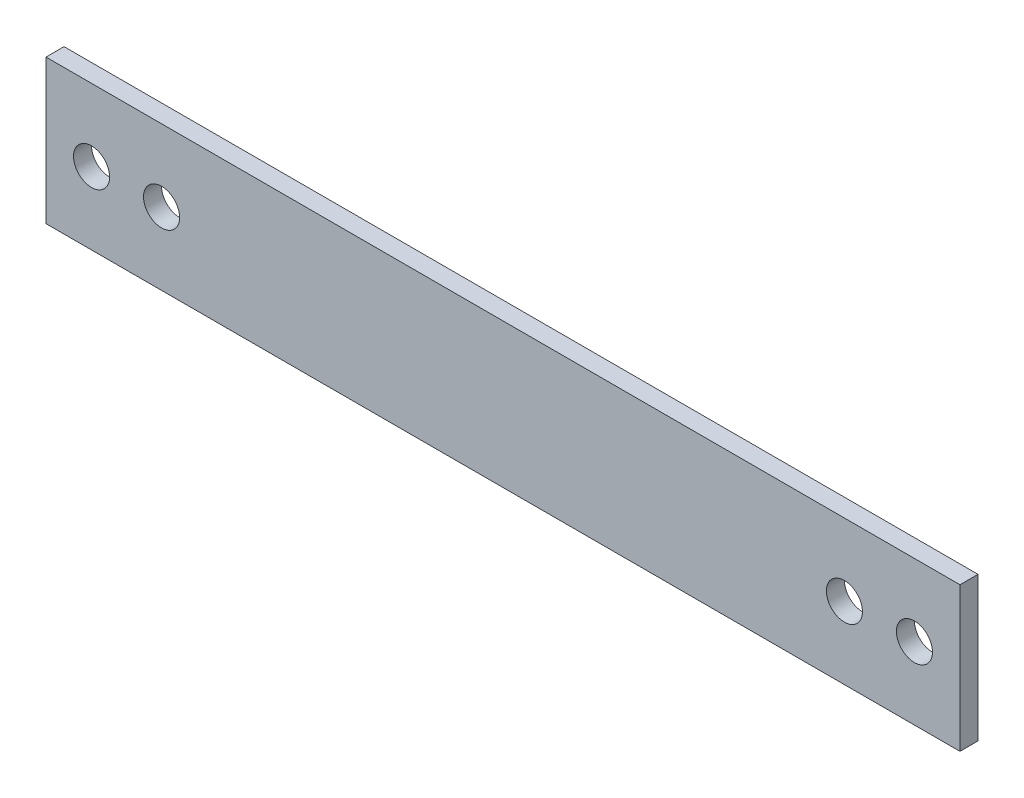
ISO-10303-21;
HEADER;
FILE_DESCRIPTION(('STEP AP214'),'2;1');
FILE_NAME('part.step','',(''),(''),'','','');
FILE_SCHEMA(('AUTOMOTIVE_DESIGN { 1 0 10303 214 1 1 1 1 }'));
ENDSEC;
DATA;
#1=APPLICATION_CONTEXT('core data for automotive mechanical design processes');
#2=APPLICATION_PROTOCOL_DEFINITION('international standard','automotive_design',2000,#1);
#3=PRODUCT_CONTEXT('',#1,'mechanical');
#4=PRODUCT('Part','Part','',(#3));
#5=PRODUCT_RELATED_PRODUCT_CATEGORY('part','',(#4));
#6=PRODUCT_DEFINITION_FORMATION('','',#4);
#7=PRODUCT_DEFINITION_CONTEXT('part definition',#1,'design');
#8=PRODUCT_DEFINITION('design','',#6,#7);
#9=PRODUCT_DEFINITION_SHAPE('','',#8);
#10=(LENGTH_UNIT() NAMED_UNIT(*) SI_UNIT(.MILLI.,.METRE.));
#11=(NAMED_UNIT(*) PLANE_ANGLE_UNIT() SI_UNIT($,.RADIAN.));
#12=(NAMED_UNIT(*) SI_UNIT($,.STERADIAN.) SOLID_ANGLE_UNIT());
#13=UNCERTAINTY_MEASURE_WITH_UNIT(LENGTH_MEASURE(1.E-05),#10,'distance_accuracy_value','');
#14=(GEOMETRIC_REPRESENTATION_CONTEXT(3) GLOBAL_UNCERTAINTY_ASSIGNED_CONTEXT((#13)) GLOBAL_UNIT_ASSIGNED_CONTEXT((#10,
#11,#12)) REPRESENTATION_CONTEXT('',''));
#15=CARTESIAN_POINT('',(0.,0.,0.));
#16=DIRECTION('',(0.,0.,1.));
#17=DIRECTION('',(1.,0.,0.));
#18=AXIS2_PLACEMENT_3D('',#15,#16,#17);
#19=CARTESIAN_POINT('',(0.,0.,4.7625));
#20=DIRECTION('',(0.,0.,-1.));
#21=DIRECTION('',(-1.,0.,0.));
#22=AXIS2_PLACEMENT_3D('',#19,#20,#21);
#23=PLANE('',#22);
#24=DIRECTION('',(0.,1.,0.));
#25=VECTOR('',#24,1.);
#26=CARTESIAN_POINT('',(120.65,-19.05,4.7625));
#27=LINE('',#26,#25);
#28=CARTESIAN_POINT('',(120.65,-19.05,4.7625));
#29=VERTEX_POINT('',#28);
#30=CARTESIAN_POINT('',(120.65,19.05,4.7625));
#31=VERTEX_POINT('',#30);
#32=EDGE_CURVE('E96',#29,#31,#27,.T.);
#33=ORIENTED_EDGE('',*,*,#32,.T.);
#34=DIRECTION('',(-1.,0.,0.));
#35=VECTOR('',#34,1.);
#36=CARTESIAN_POINT('',(-120.65,19.05,4.7625));
#37=LINE('',#36,#35);
#38=CARTESIAN_POINT('',(-120.65,19.05,4.7625));
#39=VERTEX_POINT('',#38);
#40=EDGE_CURVE('E91',#31,#39,#37,.T.);
#41=ORIENTED_EDGE('',*,*,#40,.T.);
#42=DIRECTION('',(0.,-1.,0.));
#43=VECTOR('',#42,1.);
#44=CARTESIAN_POINT('',(-120.65,-19.05,4.7625));
#45=LINE('',#44,#43);
#46=CARTESIAN_POINT('',(-120.65,-19.05,4.7625));
#47=VERTEX_POINT('',#46);
#48=EDGE_CURVE('E94',#39,#47,#45,.T.);
#49=ORIENTED_EDGE('',*,*,#48,.T.);
#50=DIRECTION('',(1.,0.,0.));
#51=VECTOR('',#50,1.);
#52=CARTESIAN_POINT('',(-120.65,-19.05,4.7625));
#53=LINE('',#52,#51);
#54=EDGE_CURVE('E61',#47,#29,#53,.T.);
#55=ORIENTED_EDGE('',*,*,#54,.T.);
#56=EDGE_LOOP('',(#33,#41,#49,#55));
#57=FACE_BOUND('',#56,.T.);
#58=CARTESIAN_POINT('',(-108.625531914894,0.,4.7625));
#59=DIRECTION('',(0.,0.,1.));
#60=DIRECTION('',(1.,0.,0.));
#61=AXIS2_PLACEMENT_3D('',#58,#59,#60);
#62=CIRCLE('',#61,4.7625);
#63=CARTESIAN_POINT('',(-113.388031914894,0.,4.7625));
#64=VERTEX_POINT('',#63);
#65=EDGE_CURVE('E116',#64,#64,#62,.T.);
#66=ORIENTED_EDGE('',*,*,#65,.F.);
#67=EDGE_LOOP('',(#66));
#68=FACE_BOUND('',#67,.T.);
#69=CARTESIAN_POINT('',(-90.1429787234043,0.,4.7625));
#70=DIRECTION('',(0.,0.,1.));
#71=DIRECTION('',(1.,0.,0.));
#72=AXIS2_PLACEMENT_3D('',#69,#70,#71);
#73=CIRCLE('',#72,4.7625);
#74=CARTESIAN_POINT('',(-94.9054787234043,0.,4.7625));
#75=VERTEX_POINT('',#74);
#76=EDGE_CURVE('E138',#75,#75,#73,.T.);
#77=ORIENTED_EDGE('',*,*,#76,.F.);
#78=EDGE_LOOP('',(#77));
#79=FACE_BOUND('',#78,.T.);
#80=CARTESIAN_POINT('',(90.1429787234043,0.,4.7625));
#81=DIRECTION('',(0.,0.,1.));
#82=DIRECTION('',(-1.,0.,0.));
#83=AXIS2_PLACEMENT_3D('',#80,#81,#82);
#84=CIRCLE('',#83,4.7625);
#85=CARTESIAN_POINT('',(85.3804787234043,0.,4.7625));
#86=VERTEX_POINT('',#85);
#87=EDGE_CURVE('E146',#86,#86,#84,.T.);
#88=ORIENTED_EDGE('',*,*,#87,.F.);
#89=EDGE_LOOP('',(#88));
#90=FACE_BOUND('',#89,.T.);
#91=CARTESIAN_POINT('',(108.625531914894,0.,4.7625));
#92=DIRECTION('',(0.,0.,1.));
#93=DIRECTION('',(-1.,0.,0.));
#94=AXIS2_PLACEMENT_3D('',#91,#92,#93);
#95=CIRCLE('',#94,4.7625);
#96=CARTESIAN_POINT('',(103.863031914894,0.,4.7625));
#97=VERTEX_POINT('',#96);
#98=EDGE_CURVE('E154',#97,#97,#95,.T.);
#99=ORIENTED_EDGE('',*,*,#98,.F.);
#100=EDGE_LOOP('',(#99));
#101=FACE_BOUND('',#100,.T.);
#102=ADVANCED_FACE('F43',(#57,#68,#79,#90,#101),#23,.F.);
#103=CARTESIAN_POINT('',(0.,0.,0.));
#104=DIRECTION('',(0.,0.,-1.));
#105=DIRECTION('',(-1.,0.,0.));
#106=AXIS2_PLACEMENT_3D('',#103,#104,#105);
#107=PLANE('',#106);
#108=CARTESIAN_POINT('',(90.1429787234043,0.,0.));
#109=DIRECTION('',(0.,0.,1.));
#110=DIRECTION('',(-1.,0.,0.));
#111=AXIS2_PLACEMENT_3D('',#108,#109,#110);
#112=CIRCLE('',#111,4.7625);
#113=CARTESIAN_POINT('',(85.3804787234043,0.,0.));
#114=VERTEX_POINT('',#113);
#115=EDGE_CURVE('E150',#114,#114,#112,.T.);
#116=ORIENTED_EDGE('',*,*,#115,.T.);
#117=EDGE_LOOP('',(#116));
#118=FACE_BOUND('',#117,.T.);
#119=CARTESIAN_POINT('',(-108.625531914894,0.,0.));
#120=DIRECTION('',(0.,0.,1.));
#121=DIRECTION('',(1.,0.,0.));
#122=AXIS2_PLACEMENT_3D('',#119,#120,#121);
#123=CIRCLE('',#122,4.7625);
#124=CARTESIAN_POINT('',(-113.388031914894,0.,0.));
#125=VERTEX_POINT('',#124);
#126=EDGE_CURVE('E134',#125,#125,#123,.T.);
#127=ORIENTED_EDGE('',*,*,#126,.T.);
#128=EDGE_LOOP('',(#127));
#129=FACE_BOUND('',#128,.T.);
#130=DIRECTION('',(0.,1.,0.));
#131=VECTOR('',#130,1.);
#132=CARTESIAN_POINT('',(120.65,-19.05,0.));
#133=LINE('',#132,#131);
#134=CARTESIAN_POINT('',(120.65,-19.05,0.));
#135=VERTEX_POINT('',#134);
#136=CARTESIAN_POINT('',(120.65,19.05,0.));
#137=VERTEX_POINT('',#136);
#138=EDGE_CURVE('E112',#135,#137,#133,.T.);
#139=ORIENTED_EDGE('',*,*,#138,.F.);
#140=DIRECTION('',(1.,0.,0.));
#141=VECTOR('',#140,1.);
#142=CARTESIAN_POINT('',(-120.65,-19.05,0.));
#143=LINE('',#142,#141);
#144=CARTESIAN_POINT('',(-120.65,-19.05,0.));
#145=VERTEX_POINT('',#144);
#146=EDGE_CURVE('E84',#145,#135,#143,.T.);
#147=ORIENTED_EDGE('',*,*,#146,.F.);
#148=DIRECTION('',(0.,-1.,0.));
#149=VECTOR('',#148,1.);
#150=CARTESIAN_POINT('',(-120.65,-19.05,0.));
#151=LINE('',#150,#149);
#152=CARTESIAN_POINT('',(-120.65,19.05,0.));
#153=VERTEX_POINT('',#152);
#154=EDGE_CURVE('E78',#153,#145,#151,.T.);
#155=ORIENTED_EDGE('',*,*,#154,.F.);
#156=DIRECTION('',(-1.,0.,0.));
#157=VECTOR('',#156,1.);
#158=CARTESIAN_POINT('',(-120.65,19.05,0.));
#159=LINE('',#158,#157);
#160=EDGE_CURVE('E101',#137,#153,#159,.T.);
#161=ORIENTED_EDGE('',*,*,#160,.F.);
#162=EDGE_LOOP('',(#139,#147,#155,#161));
#163=FACE_BOUND('',#162,.T.);
#164=CARTESIAN_POINT('',(-90.1429787234043,0.,0.));
#165=DIRECTION('',(0.,0.,1.));
#166=DIRECTION('',(1.,0.,0.));
#167=AXIS2_PLACEMENT_3D('',#164,#165,#166);
#168=CIRCLE('',#167,4.7625);
#169=CARTESIAN_POINT('',(-94.9054787234043,0.,0.));
#170=VERTEX_POINT('',#169);
#171=EDGE_CURVE('E142',#170,#170,#168,.T.);
#172=ORIENTED_EDGE('',*,*,#171,.T.);
#173=EDGE_LOOP('',(#172));
#174=FACE_BOUND('',#173,.T.);
#175=CARTESIAN_POINT('',(108.625531914894,0.,0.));
#176=DIRECTION('',(0.,0.,1.));
#177=DIRECTION('',(-1.,0.,0.));
#178=AXIS2_PLACEMENT_3D('',#175,#176,#177);
#179=CIRCLE('',#178,4.7625);
#180=CARTESIAN_POINT('',(103.863031914894,0.,0.));
#181=VERTEX_POINT('',#180);
#182=EDGE_CURVE('E158',#181,#181,#179,.T.);
#183=ORIENTED_EDGE('',*,*,#182,.T.);
#184=EDGE_LOOP('',(#183));
#185=FACE_BOUND('',#184,.T.);
#186=ADVANCED_FACE('F129',(#118,#129,#163,#174,#185),#107,.T.);
#187=CARTESIAN_POINT('',(120.65,-19.05,4.7625));
#188=DIRECTION('',(-1.,0.,0.));
#189=DIRECTION('',(0.,0.,1.));
#190=AXIS2_PLACEMENT_3D('',#187,#188,#189);
#191=PLANE('',#190);
#192=ORIENTED_EDGE('',*,*,#138,.T.);
#193=DIRECTION('',(0.,0.,-1.));
#194=VECTOR('',#193,1.);
#195=CARTESIAN_POINT('',(120.65,19.05,4.7625));
#196=LINE('',#195,#194);
#197=EDGE_CURVE('E11',#31,#137,#196,.T.);
#198=ORIENTED_EDGE('',*,*,#197,.F.);
#199=ORIENTED_EDGE('',*,*,#32,.F.);
#200=DIRECTION('',(0.,0.,-1.));
#201=VECTOR('',#200,1.);
#202=CARTESIAN_POINT('',(120.65,-19.05,4.7625));
#203=LINE('',#202,#201);
#204=EDGE_CURVE('E108',#29,#135,#203,.T.);
#205=ORIENTED_EDGE('',*,*,#204,.T.);
#206=EDGE_LOOP('',(#192,#198,#199,#205));
#207=FACE_BOUND('',#206,.T.);
#208=ADVANCED_FACE('F45',(#207),#191,.F.);
#209=CARTESIAN_POINT('',(-120.65,19.05,4.7625));
#210=DIRECTION('',(0.,-1.,0.));
#211=DIRECTION('',(0.,0.,-1.));
#212=AXIS2_PLACEMENT_3D('',#209,#210,#211);
#213=PLANE('',#212);
#214=ORIENTED_EDGE('',*,*,#160,.T.);
#215=DIRECTION('',(0.,0.,-1.));
#216=VECTOR('',#215,1.);
#217=CARTESIAN_POINT('',(-120.65,19.05,4.7625));
#218=LINE('',#217,#216);
#219=EDGE_CURVE('E53',#39,#153,#218,.T.);
#220=ORIENTED_EDGE('',*,*,#219,.F.);
#221=ORIENTED_EDGE('',*,*,#40,.F.);
#222=ORIENTED_EDGE('',*,*,#197,.T.);
#223=EDGE_LOOP('',(#214,#220,#221,#222));
#224=FACE_BOUND('',#223,.T.);
#225=ADVANCED_FACE('F100',(#224),#213,.F.);
#226=CARTESIAN_POINT('',(-120.65,-19.05,4.7625));
#227=DIRECTION('',(1.,0.,0.));
#228=DIRECTION('',(0.,0.,-1.));
#229=AXIS2_PLACEMENT_3D('',#226,#227,#228);
#230=PLANE('',#229);
#231=ORIENTED_EDGE('',*,*,#154,.T.);
#232=DIRECTION('',(0.,0.,-1.));
#233=VECTOR('',#232,1.);
#234=CARTESIAN_POINT('',(-120.65,-19.05,4.7625));
#235=LINE('',#234,#233);
#236=EDGE_CURVE('E103',#47,#145,#235,.T.);
#237=ORIENTED_EDGE('',*,*,#236,.F.);
#238=ORIENTED_EDGE('',*,*,#48,.F.);
#239=ORIENTED_EDGE('',*,*,#219,.T.);
#240=EDGE_LOOP('',(#231,#237,#238,#239));
#241=FACE_BOUND('',#240,.T.);
#242=ADVANCED_FACE('F104',(#241),#230,.F.);
#243=CARTESIAN_POINT('',(-120.65,-19.05,4.7625));
#244=DIRECTION('',(0.,1.,0.));
#245=DIRECTION('',(0.,0.,1.));
#246=AXIS2_PLACEMENT_3D('',#243,#244,#245);
#247=PLANE('',#246);
#248=ORIENTED_EDGE('',*,*,#146,.T.);
#249=ORIENTED_EDGE('',*,*,#204,.F.);
#250=ORIENTED_EDGE('',*,*,#54,.F.);
#251=ORIENTED_EDGE('',*,*,#236,.T.);
#252=EDGE_LOOP('',(#248,#249,#250,#251));
#253=FACE_BOUND('',#252,.T.);
#254=ADVANCED_FACE('F126',(#253),#247,.F.);
#255=CARTESIAN_POINT('',(-108.625531914894,0.,4.7625));
#256=DIRECTION('',(0.,0.,-1.));
#257=DIRECTION('',(-1.,0.,0.));
#258=AXIS2_PLACEMENT_3D('',#255,#256,#257);
#259=CYLINDRICAL_SURFACE('',#258,4.7625);
#260=CARTESIAN_POINT('',(-113.388031914894,0.,4.7625));
#261=CARTESIAN_POINT('',(-113.388031914894,0.,4.712890625));
#262=CARTESIAN_POINT('',(-113.388031914894,0.,4.66328125));
#263=CARTESIAN_POINT('',(-113.388031914894,0.,4.5640625));
#264=CARTESIAN_POINT('',(-113.388031914894,0.,4.514453125));
#265=CARTESIAN_POINT('',(-113.388031914894,0.,4.415234375));
#266=CARTESIAN_POINT('',(-113.388031914894,0.,4.365625));
#267=CARTESIAN_POINT('',(-113.388031914894,0.,4.26640625));
#268=CARTESIAN_POINT('',(-113.388031914894,0.,4.216796875));
#269=CARTESIAN_POINT('',(-113.388031914894,0.,4.117578125));
#270=CARTESIAN_POINT('',(-113.388031914894,0.,4.06796875));
#271=CARTESIAN_POINT('',(-113.388031914894,0.,3.96875));
#272=CARTESIAN_POINT('',(-113.388031914894,0.,3.919140625));
#273=CARTESIAN_POINT('',(-113.388031914894,0.,3.819921875));
#274=CARTESIAN_POINT('',(-113.388031914894,0.,3.7703125));
#275=CARTESIAN_POINT('',(-113.388031914894,0.,3.67109375));
#276=CARTESIAN_POINT('',(-113.388031914894,0.,3.621484375));
#277=CARTESIAN_POINT('',(-113.388031914894,0.,3.522265625));
#278=CARTESIAN_POINT('',(-113.388031914894,0.,3.47265625));
#279=CARTESIAN_POINT('',(-113.388031914894,0.,3.3734375));
#280=CARTESIAN_POINT('',(-113.388031914894,0.,3.323828125));
#281=CARTESIAN_POINT('',(-113.388031914894,0.,3.224609375));
#282=CARTESIAN_POINT('',(-113.388031914894,0.,3.175));
#283=CARTESIAN_POINT('',(-113.388031914894,0.,3.07578125));
#284=CARTESIAN_POINT('',(-113.388031914894,0.,3.026171875));
#285=CARTESIAN_POINT('',(-113.388031914894,0.,2.926953125));
#286=CARTESIAN_POINT('',(-113.388031914894,0.,2.87734375));
#287=CARTESIAN_POINT('',(-113.388031914894,0.,2.778125));
#288=CARTESIAN_POINT('',(-113.388031914894,0.,2.728515625));
#289=CARTESIAN_POINT('',(-113.388031914894,0.,2.629296875));
#290=CARTESIAN_POINT('',(-113.388031914894,0.,2.5796875));
#291=CARTESIAN_POINT('',(-113.388031914894,0.,2.48046875));
#292=CARTESIAN_POINT('',(-113.388031914894,0.,2.430859375));
#293=CARTESIAN_POINT('',(-113.388031914894,0.,2.331640625));
#294=CARTESIAN_POINT('',(-113.388031914894,0.,2.28203125));
#295=CARTESIAN_POINT('',(-113.388031914894,0.,2.1828125));
#296=CARTESIAN_POINT('',(-113.388031914894,0.,2.133203125));
#297=CARTESIAN_POINT('',(-113.388031914894,0.,2.033984375));
#298=CARTESIAN_POINT('',(-113.388031914894,0.,1.984375));
#299=CARTESIAN_POINT('',(-113.388031914894,0.,1.88515625));
#300=CARTESIAN_POINT('',(-113.388031914894,0.,1.835546875));
#301=CARTESIAN_POINT('',(-113.388031914894,0.,1.736328125));
#302=CARTESIAN_POINT('',(-113.388031914894,0.,1.68671875));
#303=CARTESIAN_POINT('',(-113.388031914894,0.,1.5875));
#304=CARTESIAN_POINT('',(-113.388031914894,0.,1.537890625));
#305=CARTESIAN_POINT('',(-113.388031914894,0.,1.438671875));
#306=CARTESIAN_POINT('',(-113.388031914894,0.,1.3890625));
#307=CARTESIAN_POINT('',(-113.388031914894,0.,1.28984375));
#308=CARTESIAN_POINT('',(-113.388031914894,0.,1.240234375));
#309=CARTESIAN_POINT('',(-113.388031914894,0.,1.141015625));
#310=CARTESIAN_POINT('',(-113.388031914894,0.,1.09140625));
#311=CARTESIAN_POINT('',(-113.388031914894,0.,0.992187499999999));
#312=CARTESIAN_POINT('',(-113.388031914894,0.,0.942578124999999));
#313=CARTESIAN_POINT('',(-113.388031914894,0.,0.843359375));
#314=CARTESIAN_POINT('',(-113.388031914894,0.,0.79375));
#315=CARTESIAN_POINT('',(-113.388031914894,0.,0.69453125));
#316=CARTESIAN_POINT('',(-113.388031914894,0.,0.644921875));
#317=CARTESIAN_POINT('',(-113.388031914894,0.,0.545703125));
#318=CARTESIAN_POINT('',(-113.388031914894,0.,0.49609375));
#319=CARTESIAN_POINT('',(-113.388031914894,0.,0.396875));
#320=CARTESIAN_POINT('',(-113.388031914894,0.,0.347265625));
#321=CARTESIAN_POINT('',(-113.388031914894,0.,0.248046875));
#322=CARTESIAN_POINT('',(-113.388031914894,0.,0.1984375));
#323=CARTESIAN_POINT('',(-113.388031914894,0.,0.09921875));
#324=CARTESIAN_POINT('',(-113.388031914894,0.,0.049609375));
#325=CARTESIAN_POINT('',(-113.388031914894,0.,0.));
#326=B_SPLINE_CURVE_WITH_KNOTS('',3,(#260,#261,#262,#263,#264,#265,#266,#267,#268,#269,#270,
#271,#272,#273,#274,#275,#276,#277,#278,#279,#280,#281,#282,#283,#284,#285,#286,#287,#288,#289,
#290,#291,#292,#293,#294,#295,#296,#297,#298,#299,#300,#301,#302,#303,#304,#305,#306,#307,#308,
#309,#310,#311,#312,#313,#314,#315,#316,#317,#318,#319,#320,#321,#322,#323,#324,#325),
.UNSPECIFIED.,.F.,.F.,(4,2,2,2,2,2,2,2,2,2,2,2,2,2,2,2,2,2,2,2,2,2,2,2,2,2,2,2,2,2,2,2,4),(0.,
0.148828125,0.29765625,0.446484375,0.5953125,0.744140625,0.892968750000001,1.041796875,1.190625,
1.339453125,1.48828125,1.637109375,1.7859375,1.934765625,2.08359375,2.232421875,2.38125,
2.530078125,2.67890625,2.827734375,2.9765625,3.125390625,3.27421875,3.423046875,3.571875,
3.720703125,3.86953125,4.018359375,4.1671875,4.316015625,4.46484375,4.613671875,4.7625),.UNSPECIFIED.);
#327=EDGE_CURVE('BSEAM177',#64,#125,#326,.T.);
#328=ORIENTED_EDGE('',*,*,#65,.T.);
#329=ORIENTED_EDGE('',*,*,#126,.F.);
#330=ORIENTED_EDGE('',*,*,#327,.T.);
#331=ORIENTED_EDGE('',*,*,#327,.F.);
#332=EDGE_LOOP('',(#328,#330,#329,#331));
#333=FACE_BOUND('',#332,.T.);
#334=ADVANCED_FACE('F177',(#333),#259,.F.);
#335=CARTESIAN_POINT('',(-90.1429787234043,0.,4.7625));
#336=DIRECTION('',(0.,0.,-1.));
#337=DIRECTION('',(-1.,0.,0.));
#338=AXIS2_PLACEMENT_3D('',#335,#336,#337);
#339=CYLINDRICAL_SURFACE('',#338,4.7625);
#340=CARTESIAN_POINT('',(-94.9054787234043,0.,4.7625));
#341=CARTESIAN_POINT('',(-94.9054787234043,0.,4.712890625));
#342=CARTESIAN_POINT('',(-94.9054787234043,0.,4.66328125));
#343=CARTESIAN_POINT('',(-94.9054787234043,0.,4.5640625));
#344=CARTESIAN_POINT('',(-94.9054787234043,0.,4.514453125));
#345=CARTESIAN_POINT('',(-94.9054787234043,0.,4.415234375));
#346=CARTESIAN_POINT('',(-94.9054787234043,0.,4.365625));
#347=CARTESIAN_POINT('',(-94.9054787234043,0.,4.26640625));
#348=CARTESIAN_POINT('',(-94.9054787234043,0.,4.216796875));
#349=CARTESIAN_POINT('',(-94.9054787234043,0.,4.117578125));
#350=CARTESIAN_POINT('',(-94.9054787234043,0.,4.06796875));
#351=CARTESIAN_POINT('',(-94.9054787234043,0.,3.96875));
#352=CARTESIAN_POINT('',(-94.9054787234043,0.,3.919140625));
#353=CARTESIAN_POINT('',(-94.9054787234043,0.,3.819921875));
#354=CARTESIAN_POINT('',(-94.9054787234043,0.,3.7703125));
#355=CARTESIAN_POINT('',(-94.9054787234043,0.,3.67109375));
#356=CARTESIAN_POINT('',(-94.9054787234043,0.,3.621484375));
#357=CARTESIAN_POINT('',(-94.9054787234043,0.,3.522265625));
#358=CARTESIAN_POINT('',(-94.9054787234043,0.,3.47265625));
#359=CARTESIAN_POINT('',(-94.9054787234043,0.,3.3734375));
#360=CARTESIAN_POINT('',(-94.9054787234043,0.,3.323828125));
#361=CARTESIAN_POINT('',(-94.9054787234043,0.,3.224609375));
#362=CARTESIAN_POINT('',(-94.9054787234043,0.,3.175));
#363=CARTESIAN_POINT('',(-94.9054787234043,0.,3.07578125));
#364=CARTESIAN_POINT('',(-94.9054787234043,0.,3.026171875));
#365=CARTESIAN_POINT('',(-94.9054787234043,0.,2.926953125));
#366=CARTESIAN_POINT('',(-94.9054787234043,0.,2.87734375));
#367=CARTESIAN_POINT('',(-94.9054787234043,0.,2.778125));
#368=CARTESIAN_POINT('',(-94.9054787234043,0.,2.728515625));
#369=CARTESIAN_POINT('',(-94.9054787234043,0.,2.629296875));
#370=CARTESIAN_POINT('',(-94.9054787234043,0.,2.5796875));
#371=CARTESIAN_POINT('',(-94.9054787234043,0.,2.48046875));
#372=CARTESIAN_POINT('',(-94.9054787234043,0.,2.430859375));
#373=CARTESIAN_POINT('',(-94.9054787234043,0.,2.331640625));
#374=CARTESIAN_POINT('',(-94.9054787234043,0.,2.28203125));
#375=CARTESIAN_POINT('',(-94.9054787234043,0.,2.1828125));
#376=CARTESIAN_POINT('',(-94.9054787234043,0.,2.133203125));
#377=CARTESIAN_POINT('',(-94.9054787234043,0.,2.033984375));
#378=CARTESIAN_POINT('',(-94.9054787234043,0.,1.984375));
#379=CARTESIAN_POINT('',(-94.9054787234043,0.,1.88515625));
#380=CARTESIAN_POINT('',(-94.9054787234043,0.,1.835546875));
#381=CARTESIAN_POINT('',(-94.9054787234043,0.,1.736328125));
#382=CARTESIAN_POINT('',(-94.9054787234043,0.,1.68671875));
#383=CARTESIAN_POINT('',(-94.9054787234043,0.,1.5875));
#384=CARTESIAN_POINT('',(-94.9054787234043,0.,1.537890625));
#385=CARTESIAN_POINT('',(-94.9054787234043,0.,1.438671875));
#386=CARTESIAN_POINT('',(-94.9054787234043,0.,1.3890625));
#387=CARTESIAN_POINT('',(-94.9054787234043,0.,1.28984375));
#388=CARTESIAN_POINT('',(-94.9054787234043,0.,1.240234375));
#389=CARTESIAN_POINT('',(-94.9054787234043,0.,1.141015625));
#390=CARTESIAN_POINT('',(-94.9054787234043,0.,1.09140625));
#391=CARTESIAN_POINT('',(-94.9054787234043,0.,0.992187499999999));
#392=CARTESIAN_POINT('',(-94.9054787234043,0.,0.942578124999999));
#393=CARTESIAN_POINT('',(-94.9054787234043,0.,0.843359375));
#394=CARTESIAN_POINT('',(-94.9054787234043,0.,0.79375));
#395=CARTESIAN_POINT('',(-94.9054787234043,0.,0.69453125));
#396=CARTESIAN_POINT('',(-94.9054787234043,0.,0.644921875));
#397=CARTESIAN_POINT('',(-94.9054787234043,0.,0.545703125));
#398=CARTESIAN_POINT('',(-94.9054787234043,0.,0.49609375));
#399=CARTESIAN_POINT('',(-94.9054787234043,0.,0.396875));
#400=CARTESIAN_POINT('',(-94.9054787234043,0.,0.347265625));
#401=CARTESIAN_POINT('',(-94.9054787234043,0.,0.248046875));
#402=CARTESIAN_POINT('',(-94.9054787234043,0.,0.1984375));
#403=CARTESIAN_POINT('',(-94.9054787234043,0.,0.09921875));
#404=CARTESIAN_POINT('',(-94.9054787234043,0.,0.049609375));
#405=CARTESIAN_POINT('',(-94.9054787234043,0.,0.));
#406=B_SPLINE_CURVE_WITH_KNOTS('',3,(#340,#341,#342,#343,#344,#345,#346,#347,#348,#349,#350,
#351,#352,#353,#354,#355,#356,#357,#358,#359,#360,#361,#362,#363,#364,#365,#366,#367,#368,#369,
#370,#371,#372,#373,#374,#375,#376,#377,#378,#379,#380,#381,#382,#383,#384,#385,#386,#387,#388,
#389,#390,#391,#392,#393,#394,#395,#396,#397,#398,#399,#400,#401,#402,#403,#404,#405),
.UNSPECIFIED.,.F.,.F.,(4,2,2,2,2,2,2,2,2,2,2,2,2,2,2,2,2,2,2,2,2,2,2,2,2,2,2,2,2,2,2,2,4),(0.,
0.148828125,0.29765625,0.446484375,0.5953125,0.744140625,0.892968750000001,1.041796875,1.190625,
1.339453125,1.48828125,1.637109375,1.7859375,1.934765625,2.08359375,2.232421875,2.38125,
2.530078125,2.67890625,2.827734375,2.9765625,3.125390625,3.27421875,3.423046875,3.571875,
3.720703125,3.86953125,4.018359375,4.1671875,4.316015625,4.46484375,4.613671875,4.7625),.UNSPECIFIED.);
#407=EDGE_CURVE('BSEAM231',#75,#170,#406,.T.);
#408=ORIENTED_EDGE('',*,*,#76,.T.);
#409=ORIENTED_EDGE('',*,*,#171,.F.);
#410=ORIENTED_EDGE('',*,*,#407,.T.);
#411=ORIENTED_EDGE('',*,*,#407,.F.);
#412=EDGE_LOOP('',(#408,#410,#409,#411));
#413=FACE_BOUND('',#412,.T.);
#414=ADVANCED_FACE('F231',(#413),#339,.F.);
#415=CARTESIAN_POINT('',(90.1429787234043,0.,4.7625));
#416=DIRECTION('',(0.,0.,-1.));
#417=DIRECTION('',(-1.,0.,0.));
#418=AXIS2_PLACEMENT_3D('',#415,#416,#417);
#419=CYLINDRICAL_SURFACE('',#418,4.7625);
#420=CARTESIAN_POINT('',(85.3804787234043,0.,4.7625));
#421=CARTESIAN_POINT('',(85.3804787234043,0.,4.712890625));
#422=CARTESIAN_POINT('',(85.3804787234043,0.,4.66328125));
#423=CARTESIAN_POINT('',(85.3804787234043,0.,4.5640625));
#424=CARTESIAN_POINT('',(85.3804787234043,0.,4.514453125));
#425=CARTESIAN_POINT('',(85.3804787234043,0.,4.415234375));
#426=CARTESIAN_POINT('',(85.3804787234043,0.,4.365625));
#427=CARTESIAN_POINT('',(85.3804787234043,0.,4.26640625));
#428=CARTESIAN_POINT('',(85.3804787234043,0.,4.216796875));
#429=CARTESIAN_POINT('',(85.3804787234043,0.,4.117578125));
#430=CARTESIAN_POINT('',(85.3804787234043,0.,4.06796875));
#431=CARTESIAN_POINT('',(85.3804787234043,0.,3.96875));
#432=CARTESIAN_POINT('',(85.3804787234043,0.,3.919140625));
#433=CARTESIAN_POINT('',(85.3804787234043,0.,3.819921875));
#434=CARTESIAN_POINT('',(85.3804787234043,0.,3.7703125));
#435=CARTESIAN_POINT('',(85.3804787234043,0.,3.67109375));
#436=CARTESIAN_POINT('',(85.3804787234043,0.,3.621484375));
#437=CARTESIAN_POINT('',(85.3804787234043,0.,3.522265625));
#438=CARTESIAN_POINT('',(85.3804787234043,0.,3.47265625));
#439=CARTESIAN_POINT('',(85.3804787234043,0.,3.3734375));
#440=CARTESIAN_POINT('',(85.3804787234043,0.,3.323828125));
#441=CARTESIAN_POINT('',(85.3804787234043,0.,3.224609375));
#442=CARTESIAN_POINT('',(85.3804787234043,0.,3.175));
#443=CARTESIAN_POINT('',(85.3804787234043,0.,3.07578125));
#444=CARTESIAN_POINT('',(85.3804787234043,0.,3.026171875));
#445=CARTESIAN_POINT('',(85.3804787234043,0.,2.926953125));
#446=CARTESIAN_POINT('',(85.3804787234043,0.,2.87734375));
#447=CARTESIAN_POINT('',(85.3804787234043,0.,2.778125));
#448=CARTESIAN_POINT('',(85.3804787234043,0.,2.728515625));
#449=CARTESIAN_POINT('',(85.3804787234043,0.,2.629296875));
#450=CARTESIAN_POINT('',(85.3804787234043,0.,2.5796875));
#451=CARTESIAN_POINT('',(85.3804787234043,0.,2.48046875));
#452=CARTESIAN_POINT('',(85.3804787234043,0.,2.430859375));
#453=CARTESIAN_POINT('',(85.3804787234043,0.,2.331640625));
#454=CARTESIAN_POINT('',(85.3804787234043,0.,2.28203125));
#455=CARTESIAN_POINT('',(85.3804787234043,0.,2.1828125));
#456=CARTESIAN_POINT('',(85.3804787234043,0.,2.133203125));
#457=CARTESIAN_POINT('',(85.3804787234043,0.,2.033984375));
#458=CARTESIAN_POINT('',(85.3804787234043,0.,1.984375));
#459=CARTESIAN_POINT('',(85.3804787234043,0.,1.88515625));
#460=CARTESIAN_POINT('',(85.3804787234043,0.,1.835546875));
#461=CARTESIAN_POINT('',(85.3804787234043,0.,1.736328125));
#462=CARTESIAN_POINT('',(85.3804787234043,0.,1.68671875));
#463=CARTESIAN_POINT('',(85.3804787234043,0.,1.5875));
#464=CARTESIAN_POINT('',(85.3804787234043,0.,1.537890625));
#465=CARTESIAN_POINT('',(85.3804787234043,0.,1.438671875));
#466=CARTESIAN_POINT('',(85.3804787234043,0.,1.3890625));
#467=CARTESIAN_POINT('',(85.3804787234043,0.,1.28984375));
#468=CARTESIAN_POINT('',(85.3804787234043,0.,1.240234375));
#469=CARTESIAN_POINT('',(85.3804787234043,0.,1.141015625));
#470=CARTESIAN_POINT('',(85.3804787234043,0.,1.09140625));
#471=CARTESIAN_POINT('',(85.3804787234043,0.,0.992187499999999));
#472=CARTESIAN_POINT('',(85.3804787234043,0.,0.942578124999999));
#473=CARTESIAN_POINT('',(85.3804787234043,0.,0.843359375));
#474=CARTESIAN_POINT('',(85.3804787234043,0.,0.79375));
#475=CARTESIAN_POINT('',(85.3804787234043,0.,0.69453125));
#476=CARTESIAN_POINT('',(85.3804787234043,0.,0.644921875));
#477=CARTESIAN_POINT('',(85.3804787234043,0.,0.545703125));
#478=CARTESIAN_POINT('',(85.3804787234043,0.,0.49609375));
#479=CARTESIAN_POINT('',(85.3804787234043,0.,0.396875));
#480=CARTESIAN_POINT('',(85.3804787234043,0.,0.347265625));
#481=CARTESIAN_POINT('',(85.3804787234043,0.,0.248046875));
#482=CARTESIAN_POINT('',(85.3804787234043,0.,0.1984375));
#483=CARTESIAN_POINT('',(85.3804787234043,0.,0.09921875));
#484=CARTESIAN_POINT('',(85.3804787234043,0.,0.049609375));
#485=CARTESIAN_POINT('',(85.3804787234043,0.,0.));
#486=B_SPLINE_CURVE_WITH_KNOTS('',3,(#420,#421,#422,#423,#424,#425,#426,#427,#428,#429,#430,
#431,#432,#433,#434,#435,#436,#437,#438,#439,#440,#441,#442,#443,#444,#445,#446,#447,#448,#449,
#450,#451,#452,#453,#454,#455,#456,#457,#458,#459,#460,#461,#462,#463,#464,#465,#466,#467,#468,
#469,#470,#471,#472,#473,#474,#475,#476,#477,#478,#479,#480,#481,#482,#483,#484,#485),
.UNSPECIFIED.,.F.,.F.,(4,2,2,2,2,2,2,2,2,2,2,2,2,2,2,2,2,2,2,2,2,2,2,2,2,2,2,2,2,2,2,2,4),(0.,
0.148828125,0.29765625,0.446484375,0.5953125,0.744140625,0.892968750000001,1.041796875,1.190625,
1.339453125,1.48828125,1.637109375,1.7859375,1.934765625,2.08359375,2.232421875,2.38125,
2.530078125,2.67890625,2.827734375,2.9765625,3.125390625,3.27421875,3.423046875,3.571875,
3.720703125,3.86953125,4.018359375,4.1671875,4.316015625,4.46484375,4.613671875,4.7625),.UNSPECIFIED.);
#487=EDGE_CURVE('BSEAM240',#86,#114,#486,.T.);
#488=ORIENTED_EDGE('',*,*,#87,.T.);
#489=ORIENTED_EDGE('',*,*,#115,.F.);
#490=ORIENTED_EDGE('',*,*,#487,.T.);
#491=ORIENTED_EDGE('',*,*,#487,.F.);
#492=EDGE_LOOP('',(#488,#490,#489,#491));
#493=FACE_BOUND('',#492,.T.);
#494=ADVANCED_FACE('F240',(#493),#419,.F.);
#495=CARTESIAN_POINT('',(108.625531914894,0.,4.7625));
#496=DIRECTION('',(0.,0.,-1.));
#497=DIRECTION('',(-1.,0.,0.));
#498=AXIS2_PLACEMENT_3D('',#495,#496,#497);
#499=CYLINDRICAL_SURFACE('',#498,4.7625);
#500=CARTESIAN_POINT('',(103.863031914894,0.,4.7625));
#501=CARTESIAN_POINT('',(103.863031914894,0.,4.712890625));
#502=CARTESIAN_POINT('',(103.863031914894,0.,4.66328125));
#503=CARTESIAN_POINT('',(103.863031914894,0.,4.5640625));
#504=CARTESIAN_POINT('',(103.863031914894,0.,4.514453125));
#505=CARTESIAN_POINT('',(103.863031914894,0.,4.415234375));
#506=CARTESIAN_POINT('',(103.863031914894,0.,4.365625));
#507=CARTESIAN_POINT('',(103.863031914894,0.,4.26640625));
#508=CARTESIAN_POINT('',(103.863031914894,0.,4.216796875));
#509=CARTESIAN_POINT('',(103.863031914894,0.,4.117578125));
#510=CARTESIAN_POINT('',(103.863031914894,0.,4.06796875));
#511=CARTESIAN_POINT('',(103.863031914894,0.,3.96875));
#512=CARTESIAN_POINT('',(103.863031914894,0.,3.919140625));
#513=CARTESIAN_POINT('',(103.863031914894,0.,3.819921875));
#514=CARTESIAN_POINT('',(103.863031914894,0.,3.7703125));
#515=CARTESIAN_POINT('',(103.863031914894,0.,3.67109375));
#516=CARTESIAN_POINT('',(103.863031914894,0.,3.621484375));
#517=CARTESIAN_POINT('',(103.863031914894,0.,3.522265625));
#518=CARTESIAN_POINT('',(103.863031914894,0.,3.47265625));
#519=CARTESIAN_POINT('',(103.863031914894,0.,3.3734375));
#520=CARTESIAN_POINT('',(103.863031914894,0.,3.323828125));
#521=CARTESIAN_POINT('',(103.863031914894,0.,3.224609375));
#522=CARTESIAN_POINT('',(103.863031914894,0.,3.175));
#523=CARTESIAN_POINT('',(103.863031914894,0.,3.07578125));
#524=CARTESIAN_POINT('',(103.863031914894,0.,3.026171875));
#525=CARTESIAN_POINT('',(103.863031914894,0.,2.926953125));
#526=CARTESIAN_POINT('',(103.863031914894,0.,2.87734375));
#527=CARTESIAN_POINT('',(103.863031914894,0.,2.778125));
#528=CARTESIAN_POINT('',(103.863031914894,0.,2.728515625));
#529=CARTESIAN_POINT('',(103.863031914894,0.,2.629296875));
#530=CARTESIAN_POINT('',(103.863031914894,0.,2.5796875));
#531=CARTESIAN_POINT('',(103.863031914894,0.,2.48046875));
#532=CARTESIAN_POINT('',(103.863031914894,0.,2.430859375));
#533=CARTESIAN_POINT('',(103.863031914894,0.,2.331640625));
#534=CARTESIAN_POINT('',(103.863031914894,0.,2.28203125));
#535=CARTESIAN_POINT('',(103.863031914894,0.,2.1828125));
#536=CARTESIAN_POINT('',(103.863031914894,0.,2.133203125));
#537=CARTESIAN_POINT('',(103.863031914894,0.,2.033984375));
#538=CARTESIAN_POINT('',(103.863031914894,0.,1.984375));
#539=CARTESIAN_POINT('',(103.863031914894,0.,1.88515625));
#540=CARTESIAN_POINT('',(103.863031914894,0.,1.835546875));
#541=CARTESIAN_POINT('',(103.863031914894,0.,1.736328125));
#542=CARTESIAN_POINT('',(103.863031914894,0.,1.68671875));
#543=CARTESIAN_POINT('',(103.863031914894,0.,1.5875));
#544=CARTESIAN_POINT('',(103.863031914894,0.,1.537890625));
#545=CARTESIAN_POINT('',(103.863031914894,0.,1.438671875));
#546=CARTESIAN_POINT('',(103.863031914894,0.,1.3890625));
#547=CARTESIAN_POINT('',(103.863031914894,0.,1.28984375));
#548=CARTESIAN_POINT('',(103.863031914894,0.,1.240234375));
#549=CARTESIAN_POINT('',(103.863031914894,0.,1.141015625));
#550=CARTESIAN_POINT('',(103.863031914894,0.,1.09140625));
#551=CARTESIAN_POINT('',(103.863031914894,0.,0.992187499999999));
#552=CARTESIAN_POINT('',(103.863031914894,0.,0.942578124999999));
#553=CARTESIAN_POINT('',(103.863031914894,0.,0.843359375));
#554=CARTESIAN_POINT('',(103.863031914894,0.,0.79375));
#555=CARTESIAN_POINT('',(103.863031914894,0.,0.69453125));
#556=CARTESIAN_POINT('',(103.863031914894,0.,0.644921875));
#557=CARTESIAN_POINT('',(103.863031914894,0.,0.545703125));
#558=CARTESIAN_POINT('',(103.863031914894,0.,0.49609375));
#559=CARTESIAN_POINT('',(103.863031914894,0.,0.396875));
#560=CARTESIAN_POINT('',(103.863031914894,0.,0.347265625));
#561=CARTESIAN_POINT('',(103.863031914894,0.,0.248046875));
#562=CARTESIAN_POINT('',(103.863031914894,0.,0.1984375));
#563=CARTESIAN_POINT('',(103.863031914894,0.,0.09921875));
#564=CARTESIAN_POINT('',(103.863031914894,0.,0.049609375));
#565=CARTESIAN_POINT('',(103.863031914894,0.,0.));
#566=B_SPLINE_CURVE_WITH_KNOTS('',3,(#500,#501,#502,#503,#504,#505,#506,#507,#508,#509,#510,
#511,#512,#513,#514,#515,#516,#517,#518,#519,#520,#521,#522,#523,#524,#525,#526,#527,#528,#529,
#530,#531,#532,#533,#534,#535,#536,#537,#538,#539,#540,#541,#542,#543,#544,#545,#546,#547,#548,
#549,#550,#551,#552,#553,#554,#555,#556,#557,#558,#559,#560,#561,#562,#563,#564,#565),
.UNSPECIFIED.,.F.,.F.,(4,2,2,2,2,2,2,2,2,2,2,2,2,2,2,2,2,2,2,2,2,2,2,2,2,2,2,2,2,2,2,2,4),(0.,
0.148828125,0.29765625,0.446484375,0.5953125,0.744140625,0.892968750000001,1.041796875,1.190625,
1.339453125,1.48828125,1.637109375,1.7859375,1.934765625,2.08359375,2.232421875,2.38125,
2.530078125,2.67890625,2.827734375,2.9765625,3.125390625,3.27421875,3.423046875,3.571875,
3.720703125,3.86953125,4.018359375,4.1671875,4.316015625,4.46484375,4.613671875,4.7625),.UNSPECIFIED.);
#567=EDGE_CURVE('BSEAM166',#97,#181,#566,.T.);
#568=ORIENTED_EDGE('',*,*,#98,.T.);
#569=ORIENTED_EDGE('',*,*,#182,.F.);
#570=ORIENTED_EDGE('',*,*,#567,.T.);
#571=ORIENTED_EDGE('',*,*,#567,.F.);
#572=EDGE_LOOP('',(#568,#570,#569,#571));
#573=FACE_BOUND('',#572,.T.);
#574=ADVANCED_FACE('F166',(#573),#499,.F.);
#575=CLOSED_SHELL('',(#102,#186,#208,#225,#242,#254,#334,#414,#494,#574));
#576=MANIFOLD_SOLID_BREP('B2',#575);
#577=ADVANCED_BREP_SHAPE_REPRESENTATION('',(#18,#576),#14);
#578=SHAPE_DEFINITION_REPRESENTATION(#9,#577);
ENDSEC;
END-ISO-10303-21;
